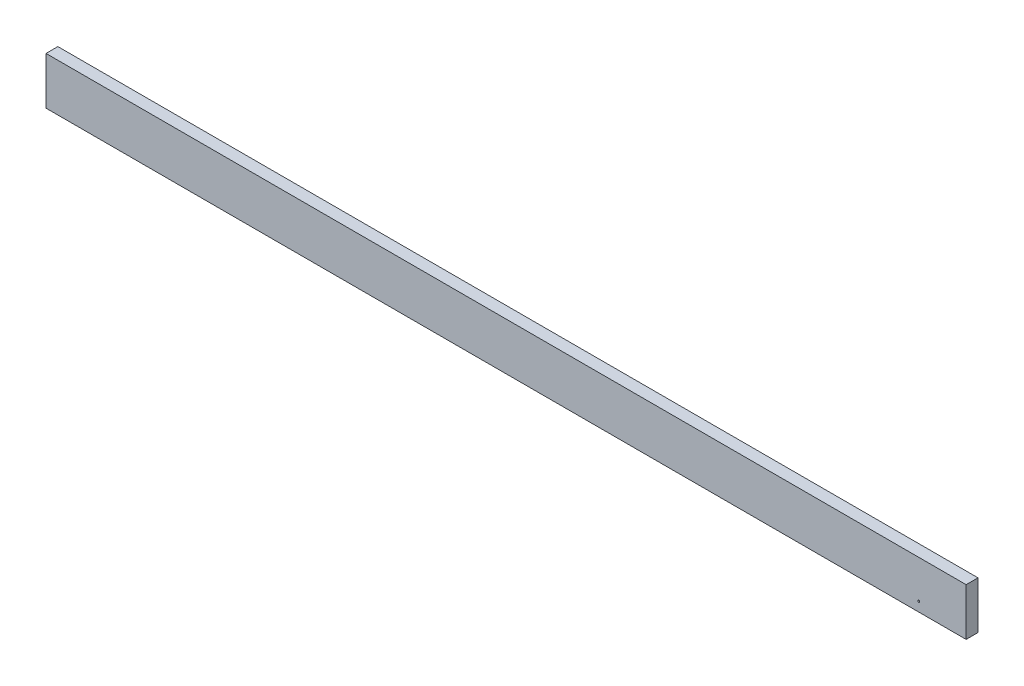
ISO-10303-21;
HEADER;
FILE_DESCRIPTION(('STEP AP214'),'2;1');
FILE_NAME('part.step','',(''),(''),'','','');
FILE_SCHEMA(('AUTOMOTIVE_DESIGN { 1 0 10303 214 1 1 1 1 }'));
ENDSEC;
DATA;
#1=APPLICATION_CONTEXT('core data for automotive mechanical design processes');
#2=APPLICATION_PROTOCOL_DEFINITION('international standard','automotive_design',2000,#1);
#3=PRODUCT_CONTEXT('',#1,'mechanical');
#4=PRODUCT('Part','Part','',(#3));
#5=PRODUCT_RELATED_PRODUCT_CATEGORY('part','',(#4));
#6=PRODUCT_DEFINITION_FORMATION('','',#4);
#7=PRODUCT_DEFINITION_CONTEXT('part definition',#1,'design');
#8=PRODUCT_DEFINITION('design','',#6,#7);
#9=PRODUCT_DEFINITION_SHAPE('','',#8);
#10=(LENGTH_UNIT() NAMED_UNIT(*) SI_UNIT(.MILLI.,.METRE.));
#11=(NAMED_UNIT(*) PLANE_ANGLE_UNIT() SI_UNIT($,.RADIAN.));
#12=(NAMED_UNIT(*) SI_UNIT($,.STERADIAN.) SOLID_ANGLE_UNIT());
#13=UNCERTAINTY_MEASURE_WITH_UNIT(LENGTH_MEASURE(1.E-05),#10,'distance_accuracy_value','');
#14=(GEOMETRIC_REPRESENTATION_CONTEXT(3) GLOBAL_UNCERTAINTY_ASSIGNED_CONTEXT((#13)) GLOBAL_UNIT_ASSIGNED_CONTEXT((#10,
#11,#12)) REPRESENTATION_CONTEXT('',''));
#15=CARTESIAN_POINT('',(0.,0.,0.));
#16=DIRECTION('',(0.,0.,1.));
#17=DIRECTION('',(1.,0.,0.));
#18=AXIS2_PLACEMENT_3D('',#15,#16,#17);
#19=CARTESIAN_POINT('',(0.,0.,25.));
#20=DIRECTION('',(1.,0.,0.));
#21=DIRECTION('',(0.,0.,-1.));
#22=AXIS2_PLACEMENT_3D('',#19,#20,#21);
#23=PLANE('',#22);
#24=DIRECTION('',(0.,-1.,0.));
#25=VECTOR('',#24,1.);
#26=CARTESIAN_POINT('',(0.,0.,0.));
#27=LINE('',#26,#25);
#28=CARTESIAN_POINT('',(0.,100.,0.));
#29=VERTEX_POINT('',#28);
#30=CARTESIAN_POINT('',(0.,0.,0.));
#31=VERTEX_POINT('',#30);
#32=EDGE_CURVE('E109',#29,#31,#27,.T.);
#33=ORIENTED_EDGE('',*,*,#32,.T.);
#34=DIRECTION('',(0.,0.,-1.));
#35=VECTOR('',#34,1.);
#36=CARTESIAN_POINT('',(0.,0.,25.));
#37=LINE('',#36,#35);
#38=CARTESIAN_POINT('',(0.,0.,25.));
#39=VERTEX_POINT('',#38);
#40=EDGE_CURVE('E11',#39,#31,#37,.T.);
#41=ORIENTED_EDGE('',*,*,#40,.F.);
#42=DIRECTION('',(0.,-1.,0.));
#43=VECTOR('',#42,1.);
#44=CARTESIAN_POINT('',(0.,0.,25.));
#45=LINE('',#44,#43);
#46=CARTESIAN_POINT('',(0.,100.,25.));
#47=VERTEX_POINT('',#46);
#48=EDGE_CURVE('E98',#47,#39,#45,.T.);
#49=ORIENTED_EDGE('',*,*,#48,.F.);
#50=DIRECTION('',(0.,0.,-1.));
#51=VECTOR('',#50,1.);
#52=CARTESIAN_POINT('',(0.,100.,25.));
#53=LINE('',#52,#51);
#54=EDGE_CURVE('E106',#47,#29,#53,.T.);
#55=ORIENTED_EDGE('',*,*,#54,.T.);
#56=EDGE_LOOP('',(#33,#41,#49,#55));
#57=FACE_BOUND('',#56,.T.);
#58=ADVANCED_FACE('F50',(#57),#23,.F.);
#59=CARTESIAN_POINT('',(0.,0.,25.));
#60=DIRECTION('',(0.,1.,0.));
#61=DIRECTION('',(0.,0.,1.));
#62=AXIS2_PLACEMENT_3D('',#59,#60,#61);
#63=PLANE('',#62);
#64=DIRECTION('',(1.,0.,0.));
#65=VECTOR('',#64,1.);
#66=CARTESIAN_POINT('',(0.,0.,0.));
#67=LINE('',#66,#65);
#68=CARTESIAN_POINT('',(1940.,0.,0.));
#69=VERTEX_POINT('',#68);
#70=EDGE_CURVE('E105',#31,#69,#67,.T.);
#71=ORIENTED_EDGE('',*,*,#70,.T.);
#72=DIRECTION('',(0.,0.,-1.));
#73=VECTOR('',#72,1.);
#74=CARTESIAN_POINT('',(1940.,0.,25.));
#75=LINE('',#74,#73);
#76=CARTESIAN_POINT('',(1940.,0.,25.));
#77=VERTEX_POINT('',#76);
#78=EDGE_CURVE('E54',#77,#69,#75,.T.);
#79=ORIENTED_EDGE('',*,*,#78,.F.);
#80=DIRECTION('',(1.,0.,0.));
#81=VECTOR('',#80,1.);
#82=CARTESIAN_POINT('',(0.,0.,25.));
#83=LINE('',#82,#81);
#84=EDGE_CURVE('E91',#39,#77,#83,.T.);
#85=ORIENTED_EDGE('',*,*,#84,.F.);
#86=ORIENTED_EDGE('',*,*,#40,.T.);
#87=EDGE_LOOP('',(#71,#79,#85,#86));
#88=FACE_BOUND('',#87,.T.);
#89=ADVANCED_FACE('F101',(#88),#63,.F.);
#90=CARTESIAN_POINT('',(1940.,0.,25.));
#91=DIRECTION('',(-1.,0.,0.));
#92=DIRECTION('',(0.,0.,1.));
#93=AXIS2_PLACEMENT_3D('',#90,#91,#92);
#94=PLANE('',#93);
#95=DIRECTION('',(0.,1.,0.));
#96=VECTOR('',#95,1.);
#97=CARTESIAN_POINT('',(1940.,0.,0.));
#98=LINE('',#97,#96);
#99=CARTESIAN_POINT('',(1940.,100.,0.));
#100=VERTEX_POINT('',#99);
#101=EDGE_CURVE('E78',#69,#100,#98,.T.);
#102=ORIENTED_EDGE('',*,*,#101,.T.);
#103=DIRECTION('',(0.,0.,-1.));
#104=VECTOR('',#103,1.);
#105=CARTESIAN_POINT('',(1940.,100.,25.));
#106=LINE('',#105,#104);
#107=CARTESIAN_POINT('',(1940.,100.,25.));
#108=VERTEX_POINT('',#107);
#109=EDGE_CURVE('E103',#108,#100,#106,.T.);
#110=ORIENTED_EDGE('',*,*,#109,.F.);
#111=DIRECTION('',(0.,1.,0.));
#112=VECTOR('',#111,1.);
#113=CARTESIAN_POINT('',(1940.,0.,25.));
#114=LINE('',#113,#112);
#115=EDGE_CURVE('E96',#77,#108,#114,.T.);
#116=ORIENTED_EDGE('',*,*,#115,.F.);
#117=ORIENTED_EDGE('',*,*,#78,.T.);
#118=EDGE_LOOP('',(#102,#110,#116,#117));
#119=FACE_BOUND('',#118,.T.);
#120=ADVANCED_FACE('F102',(#119),#94,.F.);
#121=CARTESIAN_POINT('',(0.,100.,25.));
#122=DIRECTION('',(0.,-1.,0.));
#123=DIRECTION('',(0.,0.,-1.));
#124=AXIS2_PLACEMENT_3D('',#121,#122,#123);
#125=PLANE('',#124);
#126=DIRECTION('',(-1.,0.,0.));
#127=VECTOR('',#126,1.);
#128=CARTESIAN_POINT('',(0.,100.,0.));
#129=LINE('',#128,#127);
#130=EDGE_CURVE('E88',#100,#29,#129,.T.);
#131=ORIENTED_EDGE('',*,*,#130,.T.);
#132=ORIENTED_EDGE('',*,*,#54,.F.);
#133=DIRECTION('',(-1.,0.,0.));
#134=VECTOR('',#133,1.);
#135=CARTESIAN_POINT('',(0.,100.,25.));
#136=LINE('',#135,#134);
#137=EDGE_CURVE('E65',#108,#47,#136,.T.);
#138=ORIENTED_EDGE('',*,*,#137,.F.);
#139=ORIENTED_EDGE('',*,*,#109,.T.);
#140=EDGE_LOOP('',(#131,#132,#138,#139));
#141=FACE_BOUND('',#140,.T.);
#142=ADVANCED_FACE('F120',(#141),#125,.F.);
#143=CARTESIAN_POINT('',(0.,0.,25.));
#144=DIRECTION('',(0.,0.,-1.));
#145=DIRECTION('',(-1.,0.,0.));
#146=AXIS2_PLACEMENT_3D('',#143,#144,#145);
#147=PLANE('',#146);
#148=CARTESIAN_POINT('',(1840.,19.8055118920015,25.));
#149=DIRECTION('',(0.,0.,-1.));
#150=DIRECTION('',(-1.,0.,0.));
#151=AXIS2_PLACEMENT_3D('',#148,#149,#150);
#152=CIRCLE('',#151,1.90500000000005);
#153=CARTESIAN_POINT('',(1838.095,19.8055118920015,25.));
#154=VERTEX_POINT('',#153);
#155=EDGE_CURVE('E114',#154,#154,#152,.T.);
#156=ORIENTED_EDGE('',*,*,#155,.T.);
#157=EDGE_LOOP('',(#156));
#158=FACE_BOUND('',#157,.T.);
#159=ORIENTED_EDGE('',*,*,#48,.T.);
#160=ORIENTED_EDGE('',*,*,#84,.T.);
#161=ORIENTED_EDGE('',*,*,#115,.T.);
#162=ORIENTED_EDGE('',*,*,#137,.T.);
#163=EDGE_LOOP('',(#159,#160,#161,#162));
#164=FACE_BOUND('',#163,.T.);
#165=ADVANCED_FACE('F94',(#158,#164),#147,.F.);
#166=CARTESIAN_POINT('',(0.,0.,0.));
#167=DIRECTION('',(0.,0.,-1.));
#168=DIRECTION('',(-1.,0.,0.));
#169=AXIS2_PLACEMENT_3D('',#166,#167,#168);
#170=PLANE('',#169);
#171=CARTESIAN_POINT('',(1840.,19.8055118920015,0.));
#172=DIRECTION('',(0.,0.,-1.));
#173=DIRECTION('',(-1.,0.,0.));
#174=AXIS2_PLACEMENT_3D('',#171,#172,#173);
#175=CIRCLE('',#174,1.90500000000005);
#176=CARTESIAN_POINT('',(1838.095,19.8055118920015,0.));
#177=VERTEX_POINT('',#176);
#178=EDGE_CURVE('E127',#177,#177,#175,.T.);
#179=ORIENTED_EDGE('',*,*,#178,.F.);
#180=EDGE_LOOP('',(#179));
#181=FACE_BOUND('',#180,.T.);
#182=ORIENTED_EDGE('',*,*,#32,.F.);
#183=ORIENTED_EDGE('',*,*,#130,.F.);
#184=ORIENTED_EDGE('',*,*,#101,.F.);
#185=ORIENTED_EDGE('',*,*,#70,.F.);
#186=EDGE_LOOP('',(#182,#183,#184,#185));
#187=FACE_BOUND('',#186,.T.);
#188=ADVANCED_FACE('F121',(#181,#187),#170,.T.);
#189=CARTESIAN_POINT('',(1840.,19.8055118920015,0.));
#190=DIRECTION('',(0.,0.,-1.));
#191=DIRECTION('',(-1.,0.,0.));
#192=AXIS2_PLACEMENT_3D('',#189,#190,#191);
#193=CYLINDRICAL_SURFACE('',#192,1.90500000000005);
#194=ORIENTED_EDGE('',*,*,#178,.T.);
#195=EDGE_LOOP('',(#194));
#196=FACE_BOUND('',#195,.T.);
#197=ORIENTED_EDGE('',*,*,#155,.F.);
#198=EDGE_LOOP('',(#197));
#199=FACE_BOUND('',#198,.T.);
#200=ADVANCED_FACE('F128',(#196,#199),#193,.F.);
#201=CLOSED_SHELL('',(#58,#89,#120,#142,#165,#188,#200));
#202=MANIFOLD_SOLID_BREP('B2',#201);
#203=ADVANCED_BREP_SHAPE_REPRESENTATION('',(#18,#202),#14);
#204=SHAPE_DEFINITION_REPRESENTATION(#9,#203);
ENDSEC;
END-ISO-10303-21;
